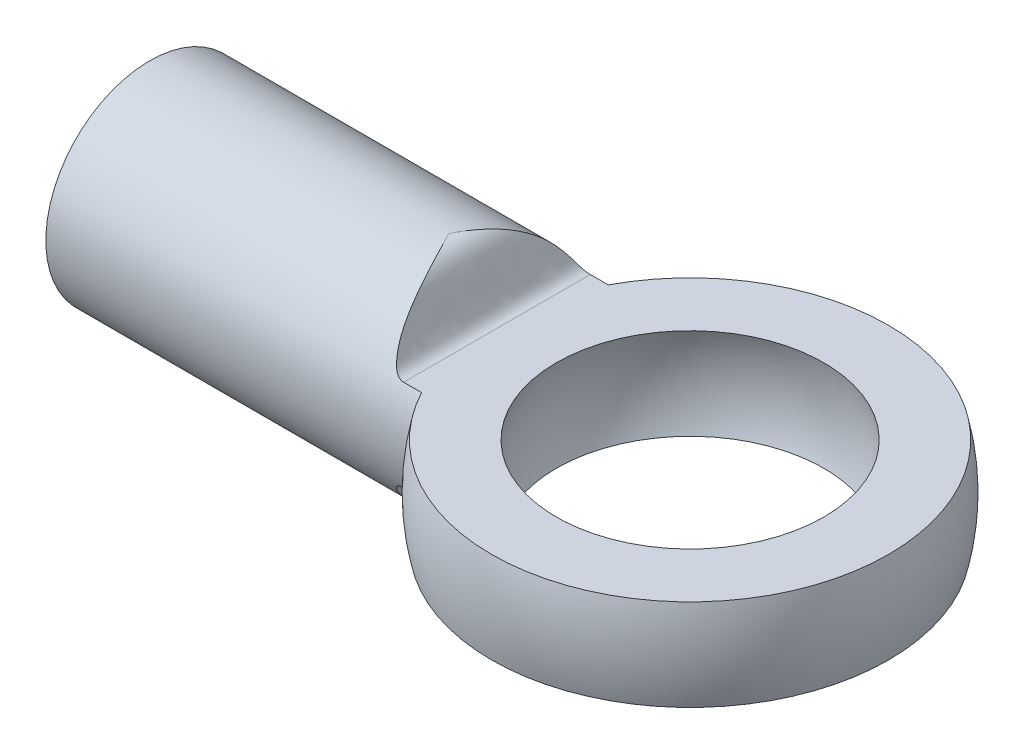
ISO-10303-21;
HEADER;
FILE_DESCRIPTION(('STEP AP214'),'2;1');
FILE_NAME('part.step','',(''),(''),'','','');
FILE_SCHEMA(('AUTOMOTIVE_DESIGN { 1 0 10303 214 1 1 1 1 }'));
ENDSEC;
DATA;
#1=APPLICATION_CONTEXT('core data for automotive mechanical design processes');
#2=APPLICATION_PROTOCOL_DEFINITION('international standard','automotive_design',2000,#1);
#3=PRODUCT_CONTEXT('',#1,'mechanical');
#4=PRODUCT('Part','Part','',(#3));
#5=PRODUCT_RELATED_PRODUCT_CATEGORY('part','',(#4));
#6=PRODUCT_DEFINITION_FORMATION('','',#4);
#7=PRODUCT_DEFINITION_CONTEXT('part definition',#1,'design');
#8=PRODUCT_DEFINITION('design','',#6,#7);
#9=PRODUCT_DEFINITION_SHAPE('','',#8);
#10=(LENGTH_UNIT() NAMED_UNIT(*) SI_UNIT(.MILLI.,.METRE.));
#11=(NAMED_UNIT(*) PLANE_ANGLE_UNIT() SI_UNIT($,.RADIAN.));
#12=(NAMED_UNIT(*) SI_UNIT($,.STERADIAN.) SOLID_ANGLE_UNIT());
#13=UNCERTAINTY_MEASURE_WITH_UNIT(LENGTH_MEASURE(1.E-05),#10,'distance_accuracy_value','');
#14=(GEOMETRIC_REPRESENTATION_CONTEXT(3) GLOBAL_UNCERTAINTY_ASSIGNED_CONTEXT((#13)) GLOBAL_UNIT_ASSIGNED_CONTEXT((#10,
#11,#12)) REPRESENTATION_CONTEXT('',''));
#15=CARTESIAN_POINT('',(0.,0.,0.));
#16=DIRECTION('',(0.,0.,1.));
#17=DIRECTION('',(1.,0.,0.));
#18=AXIS2_PLACEMENT_3D('',#15,#16,#17);
#19=CARTESIAN_POINT('',(-1.07000376947303,0.,0.));
#20=DIRECTION('',(1.,0.,0.));
#21=DIRECTION('',(0.,0.,-1.));
#22=AXIS2_PLACEMENT_3D('',#19,#20,#21);
#23=CYLINDRICAL_SURFACE('',#22,2.5);
#24=CARTESIAN_POINT('',(-13.,0.,0.));
#25=DIRECTION('',(1.,0.,0.));
#26=DIRECTION('',(0.,0.,-1.));
#27=AXIS2_PLACEMENT_3D('',#24,#25,#26);
#28=CIRCLE('',#27,2.5);
#29=CARTESIAN_POINT('',(-13.,0.,-2.5));
#30=VERTEX_POINT('',#29);
#31=EDGE_CURVE('E214',#30,#30,#28,.T.);
#32=ORIENTED_EDGE('',*,*,#31,.T.);
#33=EDGE_LOOP('',(#32));
#34=FACE_BOUND('',#33,.T.);
#35=CARTESIAN_POINT('',(-4.64650406219557,-1.1,2.24499443206436));
#36=CARTESIAN_POINT('',(-4.65358787740171,-1.09999967125129,2.24499442127416));
#37=CARTESIAN_POINT('',(-4.66067129077242,-1.1002383998479,2.24487764418432));
#38=CARTESIAN_POINT('',(-4.67479903009355,-1.10122908992279,2.2443918834458));
#39=CARTESIAN_POINT('',(-4.68184331689697,-1.10198149553234,2.24402268154721));
#40=CARTESIAN_POINT('',(-4.70277411698797,-1.10505153838962,2.24251351677639));
#41=CARTESIAN_POINT('',(-4.71652766960679,-1.10818135035136,2.24097234050416));
#42=CARTESIAN_POINT('',(-4.74321984386875,-1.1166501431242,2.23676423279798));
#43=CARTESIAN_POINT('',(-4.75615445841371,-1.12199914432153,2.23409219402461));
#44=CARTESIAN_POINT('',(-4.78075640025581,-1.13458860730942,2.22772489317636));
#45=CARTESIAN_POINT('',(-4.79242496739143,-1.14182719452623,2.22403064497305));
#46=CARTESIAN_POINT('',(-4.81844458922913,-1.16065043658863,2.21428057641237));
#47=CARTESIAN_POINT('',(-4.83220195912403,-1.17285406008639,2.20785602590706));
#48=CARTESIAN_POINT('',(-4.85750848764157,-1.19885050791023,2.19385017394148));
#49=CARTESIAN_POINT('',(-4.86904513028212,-1.21265167571546,2.18626272556819));
#50=CARTESIAN_POINT('',(-4.8963466577192,-1.24896220175239,2.16580988550255));
#51=CARTESIAN_POINT('',(-4.91088840095924,-1.27204096513273,2.15235832452112));
#52=CARTESIAN_POINT('',(-4.93093561885043,-1.3070284557925,2.13116566553633));
#53=CARTESIAN_POINT('',(-4.93733321246259,-1.31877291217642,2.12391895974521));
#54=CARTESIAN_POINT('',(-4.94973811510066,-1.34228698641715,2.10913669984174));
#55=CARTESIAN_POINT('',(-4.95574549618684,-1.35405659921132,2.10160119947191));
#56=CARTESIAN_POINT('',(-4.97336860259375,-1.38943622309456,2.07852417576554));
#57=CARTESIAN_POINT('',(-4.98452675453682,-1.41301005989113,2.06257675847777));
#58=CARTESIAN_POINT('',(-5.00572060308514,-1.45988402300676,2.02966951798857));
#59=CARTESIAN_POINT('',(-5.01575809755814,-1.48318453246195,2.0127113853329));
#60=CARTESIAN_POINT('',(-5.04673498964143,-1.55785808890464,1.95633366430632));
#61=CARTESIAN_POINT('',(-5.06589272849776,-1.6084978303646,1.91494980917182));
#62=CARTESIAN_POINT('',(-5.10196240005302,-1.70684127900028,1.82784682294097));
#63=CARTESIAN_POINT('',(-5.11887097857866,-1.75454054544729,1.78212138747797));
#64=CARTESIAN_POINT('',(-5.15212546955285,-1.84614665204281,1.68703582041841));
#65=CARTESIAN_POINT('',(-5.16847260987172,-1.89006213346152,1.63768447477214));
#66=CARTESIAN_POINT('',(-5.19326704397713,-1.95284368231409,1.56124640343536));
#67=CARTESIAN_POINT('',(-5.2015764201322,-1.97325322822113,1.53536858967057));
#68=CARTESIAN_POINT('',(-5.21830418104778,-2.01301847322483,1.48284908345514));
#69=CARTESIAN_POINT('',(-5.22672256857028,-2.03237414555487,1.45620737162899));
#70=CARTESIAN_POINT('',(-5.25350112854981,-2.09147539476314,1.37138391363323));
#71=CARTESIAN_POINT('',(-5.27223432053005,-2.12925931911334,1.31193347347293));
#72=CARTESIAN_POINT('',(-5.31142408280054,-2.19946881346809,1.19048790501048));
#73=CARTESIAN_POINT('',(-5.33188089675513,-2.23189362394212,1.12849241755841));
#74=CARTESIAN_POINT('',(-5.37486321112986,-2.29121827114159,1.00257745080242));
#75=CARTESIAN_POINT('',(-5.39738923800642,-2.3181166961591,0.938657484662151));
#76=CARTESIAN_POINT('',(-5.44466768685519,-2.36630705824672,0.809534178811279));
#77=CARTESIAN_POINT('',(-5.46942065939641,-2.38759760373933,0.744330524863584));
#78=CARTESIAN_POINT('',(-5.53936515811499,-2.43754147072666,0.567270441379082));
#79=CARTESIAN_POINT('',(-5.58672430799083,-2.46089994631202,0.454739528183783));
#80=CARTESIAN_POINT('',(-5.68771222333093,-2.49191145541659,0.230577353527971));
#81=CARTESIAN_POINT('',(-5.74132977568913,-2.49959213554635,0.118944854764666));
#82=CARTESIAN_POINT('',(-5.79927631899614,-2.49999474164144,0.00592904072314763));
#83=CARTESIAN_POINT('',(-5.80079924685742,-2.50000001333477,0.00296393327471329));
#84=CARTESIAN_POINT('',(-5.80232420778003,-2.5,0.));
#85=B_SPLINE_CURVE_WITH_KNOTS('',3,(#35,#36,#37,#38,#39,#40,#41,#42,#43,#44,#45,#46,#47,#48,#49,
#50,#51,#52,#53,#54,#55,#56,#57,#58,#59,#60,#61,#62,#63,#64,#65,#66,#67,#68,#69,#70,#71,#72,#73,
#74,#75,#76,#77,#78,#79,#80,#81,#82,#83,#84),.UNSPECIFIED.,.F.,.F.,(4,2,2,2,2,2,2,2,2,2,2,2,2,2,
2,2,2,2,2,2,2,2,2,2,4),(0.,0.0212437547785112,0.0425059004611826,0.0848255252951449,
0.127338353835936,0.169809166530501,0.227913812617447,0.286336917608966,0.377295191324441,
0.422930677717603,0.468557712535144,0.56022517201402,0.651743389792518,0.855864007583603,
1.06028569700472,1.26422742582295,1.3661728059433,1.46812077409799,1.68651023702028,
1.90493062510933,2.12340673921738,2.34193701651247,2.71359827134692,3.08460356138052,
3.09460357635037),.UNSPECIFIED.);
#86=CARTESIAN_POINT('',(-4.64650406219557,-1.1,2.24499443206436));
#87=VERTEX_POINT('',#86);
#88=CARTESIAN_POINT('',(-5.80232420778005,-2.5,0.));
#89=VERTEX_POINT('',#88);
#90=EDGE_CURVE('E96',#87,#89,#85,.T.);
#91=ORIENTED_EDGE('',*,*,#90,.F.);
#92=DIRECTION('',(1.,0.,0.));
#93=VECTOR('',#92,1.);
#94=CARTESIAN_POINT('',(-1.07000376947303,-1.1,2.24499443206436));
#95=LINE('',#94,#93);
#96=CARTESIAN_POINT('',(-4.2142615011411,-1.1,2.24499443206436));
#97=VERTEX_POINT('',#96);
#98=EDGE_CURVE('E92',#87,#97,#95,.T.);
#99=ORIENTED_EDGE('',*,*,#98,.T.);
#100=CARTESIAN_POINT('',(-4.2142615011411,0.,0.));
#101=DIRECTION('',(1.,0.,0.));
#102=DIRECTION('',(0.,0.,-1.));
#103=AXIS2_PLACEMENT_3D('',#100,#101,#102);
#104=CIRCLE('',#103,2.5);
#105=CARTESIAN_POINT('',(-4.2142615011411,1.1,2.24499443206436));
#106=VERTEX_POINT('',#105);
#107=EDGE_CURVE('E206',#106,#97,#104,.T.);
#108=ORIENTED_EDGE('',*,*,#107,.F.);
#109=DIRECTION('',(1.,0.,0.));
#110=VECTOR('',#109,1.);
#111=CARTESIAN_POINT('',(-1.07000376947303,1.1,2.24499443206436));
#112=LINE('',#111,#110);
#113=CARTESIAN_POINT('',(-4.64650406219557,1.1,2.24499443206436));
#114=VERTEX_POINT('',#113);
#115=EDGE_CURVE('E52',#106,#114,#112,.F.);
#116=ORIENTED_EDGE('',*,*,#115,.T.);
#117=CARTESIAN_POINT('',(-4.64650406219557,1.1,2.24499443206436));
#118=CARTESIAN_POINT('',(-4.65358787740171,1.09999967125129,2.24499442127416));
#119=CARTESIAN_POINT('',(-4.66067129077241,1.1002383998479,2.24487764418432));
#120=CARTESIAN_POINT('',(-4.67479903009352,1.10122908992279,2.2443918834458));
#121=CARTESIAN_POINT('',(-4.68184331689694,1.10198149553234,2.24402268154721));
#122=CARTESIAN_POINT('',(-4.70277411698792,1.10505153838961,2.2425135167764));
#123=CARTESIAN_POINT('',(-4.71652766960672,1.10818135035134,2.24097234050416));
#124=CARTESIAN_POINT('',(-4.74321984386865,1.11665014312416,2.236764232798));
#125=CARTESIAN_POINT('',(-4.75615445841361,1.12199914432148,2.23409219402463));
#126=CARTESIAN_POINT('',(-4.78075640025569,1.13458860730935,2.2277248931764));
#127=CARTESIAN_POINT('',(-4.7924249673913,1.14182719452615,2.2240306449731));
#128=CARTESIAN_POINT('',(-4.81844458922899,1.1606504365885,2.21428057641242));
#129=CARTESIAN_POINT('',(-4.83220195912388,1.17285406008622,2.20785602590706));
#130=CARTESIAN_POINT('',(-4.85750848764141,1.19885050791009,2.19385017394165));
#131=CARTESIAN_POINT('',(-4.86904513028196,1.2126516757154,2.18626272556854));
#132=CARTESIAN_POINT('',(-4.89634665771903,1.24896220175233,2.16580988550304));
#133=CARTESIAN_POINT('',(-4.91088840095907,1.27204096513248,2.15235832452135));
#134=CARTESIAN_POINT('',(-4.93093561885024,1.30702845579215,2.13116566553651));
#135=CARTESIAN_POINT('',(-4.93733321246241,1.31877291217606,2.12391895974542));
#136=CARTESIAN_POINT('',(-4.94973811510047,1.34228698641678,2.10913669984199));
#137=CARTESIAN_POINT('',(-4.95574549618664,1.35405659921094,2.10160119947216));
#138=CARTESIAN_POINT('',(-4.97336860259355,1.38943622309413,2.07852417576582));
#139=CARTESIAN_POINT('',(-4.98452675453661,1.41301005989068,2.06257675847807));
#140=CARTESIAN_POINT('',(-5.00572060308492,1.45988402300626,2.02966951798893));
#141=CARTESIAN_POINT('',(-5.01575809755792,1.48318453246143,2.01271138533329));
#142=CARTESIAN_POINT('',(-5.0467349896412,1.55785808890406,1.95633366430678));
#143=CARTESIAN_POINT('',(-5.06589272849753,1.60849783036398,1.91494980917234));
#144=CARTESIAN_POINT('',(-5.10196240005278,1.70684127899961,1.82784682294159));
#145=CARTESIAN_POINT('',(-5.11887097857841,1.7545405454466,1.78212138747865));
#146=CARTESIAN_POINT('',(-5.15212546955259,1.8461466520421,1.68703582041918));
#147=CARTESIAN_POINT('',(-5.16847260987145,1.89006213346081,1.63768447477295));
#148=CARTESIAN_POINT('',(-5.19326704397685,1.95284368231339,1.56124640343623));
#149=CARTESIAN_POINT('',(-5.20157642013192,1.97325322822044,1.53536858967146));
#150=CARTESIAN_POINT('',(-5.21830418104749,2.01301847322415,1.48284908345606));
#151=CARTESIAN_POINT('',(-5.22672256856998,2.03237414555419,1.45620737162993));
#152=CARTESIAN_POINT('',(-5.25350112854952,2.09147539476253,1.37138391363417));
#153=CARTESIAN_POINT('',(-5.27223432052977,2.12925931911279,1.31193347347383));
#154=CARTESIAN_POINT('',(-5.31142408280027,2.19946881346764,1.19048790501132));
#155=CARTESIAN_POINT('',(-5.33188089675486,2.23189362394171,1.12849241755922));
#156=CARTESIAN_POINT('',(-5.37486321112955,2.29121827114121,1.0025774508033));
#157=CARTESIAN_POINT('',(-5.39738923800607,2.31811669615874,0.938657484663125));
#158=CARTESIAN_POINT('',(-5.44466768685476,2.3663070582463,0.809534178812424));
#159=CARTESIAN_POINT('',(-5.46942065939596,2.38759760373885,0.744330524864804));
#160=CARTESIAN_POINT('',(-5.53936515811447,2.43754147072657,0.567270441380276));
#161=CARTESIAN_POINT('',(-5.58672430799024,2.46089994631273,0.45473952818485));
#162=CARTESIAN_POINT('',(-5.68771222333072,2.49191145541563,0.230577353528713));
#163=CARTESIAN_POINT('',(-5.7413297756894,2.49959213554287,0.11894485476521));
#164=CARTESIAN_POINT('',(-5.79927631899617,2.49999474164126,0.00592904072315649));
#165=CARTESIAN_POINT('',(-5.80079924685743,2.50000001333468,0.00296393327471785));
#166=CARTESIAN_POINT('',(-5.80232420778003,2.5,0.));
#167=B_SPLINE_CURVE_WITH_KNOTS('',3,(#117,#118,#119,#120,#121,#122,#123,#124,#125,#126,#127,
#128,#129,#130,#131,#132,#133,#134,#135,#136,#137,#138,#139,#140,#141,#142,#143,#144,#145,#146,
#147,#148,#149,#150,#151,#152,#153,#154,#155,#156,#157,#158,#159,#160,#161,#162,#163,#164,#165,
#166),.UNSPECIFIED.,.F.,.F.,(4,2,2,2,2,2,2,2,2,2,2,2,2,2,2,2,2,2,2,2,2,2,2,2,4),(0.,
0.0212437547784895,0.0425059004611395,0.0848255252950576,0.127338353835805,0.169809166530327,
0.227913812617215,0.286336917608673,0.377295191324031,0.422930677717145,0.468557712534632,
0.560225172013416,0.651743389791807,0.855864007582712,1.06028569700367,1.26422742582182,
1.36617280594214,1.46812077409679,1.68651023701925,1.90493062510843,2.12340673921618,
2.34193701651105,2.71359827134579,3.08460356138052,3.09460357635035),.UNSPECIFIED.);
#168=CARTESIAN_POINT('',(-5.80232420778005,2.5,0.));
#169=VERTEX_POINT('',#168);
#170=EDGE_CURVE('E155',#169,#114,#167,.F.);
#171=ORIENTED_EDGE('',*,*,#170,.F.);
#172=CARTESIAN_POINT('',(-4.64650406219557,1.1,-2.24499443206436));
#173=CARTESIAN_POINT('',(-4.65358787740171,1.09999967125129,-2.24499442127416));
#174=CARTESIAN_POINT('',(-4.66067129077241,1.1002383998479,-2.24487764418432));
#175=CARTESIAN_POINT('',(-4.67479903009352,1.10122908992279,-2.2443918834458));
#176=CARTESIAN_POINT('',(-4.68184331689694,1.10198149553234,-2.24402268154721));
#177=CARTESIAN_POINT('',(-4.70277411698792,1.10505153838961,-2.2425135167764));
#178=CARTESIAN_POINT('',(-4.71652766960672,1.10818135035134,-2.24097234050416));
#179=CARTESIAN_POINT('',(-4.74321984386865,1.11665014312416,-2.236764232798));
#180=CARTESIAN_POINT('',(-4.75615445841361,1.12199914432148,-2.23409219402463));
#181=CARTESIAN_POINT('',(-4.78075640025569,1.13458860730935,-2.2277248931764));
#182=CARTESIAN_POINT('',(-4.7924249673913,1.14182719452615,-2.2240306449731));
#183=CARTESIAN_POINT('',(-4.81844458922899,1.1606504365885,-2.21428057641242));
#184=CARTESIAN_POINT('',(-4.83220195912388,1.17285406008622,-2.20785602590706));
#185=CARTESIAN_POINT('',(-4.85750848764141,1.19885050791009,-2.19385017394165));
#186=CARTESIAN_POINT('',(-4.86904513028196,1.2126516757154,-2.18626272556854));
#187=CARTESIAN_POINT('',(-4.89634665771903,1.24896220175233,-2.16580988550304));
#188=CARTESIAN_POINT('',(-4.91088840095907,1.27204096513248,-2.15235832452135));
#189=CARTESIAN_POINT('',(-4.93093561885024,1.30702845579215,-2.13116566553651));
#190=CARTESIAN_POINT('',(-4.93733321246241,1.31877291217606,-2.12391895974542));
#191=CARTESIAN_POINT('',(-4.94973811510047,1.34228698641678,-2.10913669984199));
#192=CARTESIAN_POINT('',(-4.95574549618664,1.35405659921094,-2.10160119947216));
#193=CARTESIAN_POINT('',(-4.97336860259355,1.38943622309413,-2.07852417576582));
#194=CARTESIAN_POINT('',(-4.98452675453661,1.41301005989068,-2.06257675847807));
#195=CARTESIAN_POINT('',(-5.00572060308492,1.45988402300626,-2.02966951798893));
#196=CARTESIAN_POINT('',(-5.01575809755792,1.48318453246143,-2.01271138533329));
#197=CARTESIAN_POINT('',(-5.0467349896412,1.55785808890406,-1.95633366430678));
#198=CARTESIAN_POINT('',(-5.06589272849753,1.60849783036398,-1.91494980917234));
#199=CARTESIAN_POINT('',(-5.10196240005278,1.70684127899961,-1.82784682294159));
#200=CARTESIAN_POINT('',(-5.11887097857841,1.7545405454466,-1.78212138747865));
#201=CARTESIAN_POINT('',(-5.15212546955259,1.8461466520421,-1.68703582041918));
#202=CARTESIAN_POINT('',(-5.16847260987145,1.89006213346081,-1.63768447477295));
#203=CARTESIAN_POINT('',(-5.19326704397685,1.95284368231339,-1.56124640343623));
#204=CARTESIAN_POINT('',(-5.20157642013192,1.97325322822044,-1.53536858967146));
#205=CARTESIAN_POINT('',(-5.21830418104749,2.01301847322415,-1.48284908345606));
#206=CARTESIAN_POINT('',(-5.22672256856998,2.03237414555419,-1.45620737162993));
#207=CARTESIAN_POINT('',(-5.25350112854952,2.09147539476253,-1.37138391363417));
#208=CARTESIAN_POINT('',(-5.27223432052977,2.12925931911279,-1.31193347347383));
#209=CARTESIAN_POINT('',(-5.31142408280027,2.19946881346764,-1.19048790501132));
#210=CARTESIAN_POINT('',(-5.33188089675486,2.23189362394171,-1.12849241755922));
#211=CARTESIAN_POINT('',(-5.37486321112955,2.29121827114121,-1.0025774508033));
#212=CARTESIAN_POINT('',(-5.39738923800607,2.31811669615874,-0.938657484663125));
#213=CARTESIAN_POINT('',(-5.44466768685476,2.3663070582463,-0.809534178812424));
#214=CARTESIAN_POINT('',(-5.46942065939596,2.38759760373885,-0.744330524864804));
#215=CARTESIAN_POINT('',(-5.53936515811447,2.43754147072657,-0.567270441380276));
#216=CARTESIAN_POINT('',(-5.58672430799024,2.46089994631273,-0.45473952818485));
#217=CARTESIAN_POINT('',(-5.68771222333072,2.49191145541563,-0.230577353528713));
#218=CARTESIAN_POINT('',(-5.7413297756894,2.49959213554287,-0.11894485476521));
#219=CARTESIAN_POINT('',(-5.79927631899617,2.49999474164126,-0.00592904072315649));
#220=CARTESIAN_POINT('',(-5.80079924685743,2.50000001333468,-0.00296393327471785));
#221=CARTESIAN_POINT('',(-5.80232420778003,2.5,0.));
#222=B_SPLINE_CURVE_WITH_KNOTS('',3,(#172,#173,#174,#175,#176,#177,#178,#179,#180,#181,#182,
#183,#184,#185,#186,#187,#188,#189,#190,#191,#192,#193,#194,#195,#196,#197,#198,#199,#200,#201,
#202,#203,#204,#205,#206,#207,#208,#209,#210,#211,#212,#213,#214,#215,#216,#217,#218,#219,#220,
#221),.UNSPECIFIED.,.F.,.F.,(4,2,2,2,2,2,2,2,2,2,2,2,2,2,2,2,2,2,2,2,2,2,2,2,4),(0.,
0.0212437547784895,0.0425059004611395,0.0848255252950576,0.127338353835805,0.169809166530327,
0.227913812617215,0.286336917608673,0.377295191324031,0.422930677717145,0.468557712534632,
0.560225172013416,0.651743389791807,0.855864007582712,1.06028569700367,1.26422742582182,
1.36617280594214,1.46812077409679,1.68651023701925,1.90493062510843,2.12340673921618,
2.34193701651105,2.71359827134579,3.08460356138052,3.09460357635035),.UNSPECIFIED.);
#223=CARTESIAN_POINT('',(-4.64650406219557,1.1,-2.24499443206436));
#224=VERTEX_POINT('',#223);
#225=EDGE_CURVE('E95',#169,#224,#222,.F.);
#226=ORIENTED_EDGE('',*,*,#225,.T.);
#227=DIRECTION('',(1.,0.,0.));
#228=VECTOR('',#227,1.);
#229=CARTESIAN_POINT('',(-1.07000376947303,1.1,-2.24499443206436));
#230=LINE('',#229,#228);
#231=CARTESIAN_POINT('',(-4.2142615011411,1.1,-2.24499443206436));
#232=VERTEX_POINT('',#231);
#233=EDGE_CURVE('E60',#224,#232,#230,.T.);
#234=ORIENTED_EDGE('',*,*,#233,.T.);
#235=CARTESIAN_POINT('',(-4.2142615011411,-1.1,-2.24499443206436));
#236=VERTEX_POINT('',#235);
#237=EDGE_CURVE('E102',#236,#232,#104,.T.);
#238=ORIENTED_EDGE('',*,*,#237,.F.);
#239=DIRECTION('',(1.,0.,0.));
#240=VECTOR('',#239,1.);
#241=CARTESIAN_POINT('',(-1.07000376947303,-1.1,-2.24499443206436));
#242=LINE('',#241,#240);
#243=CARTESIAN_POINT('',(-4.64650406219557,-1.1,-2.24499443206436));
#244=VERTEX_POINT('',#243);
#245=EDGE_CURVE('E91',#236,#244,#242,.F.);
#246=ORIENTED_EDGE('',*,*,#245,.T.);
#247=CARTESIAN_POINT('',(-4.64650406219557,-1.1,-2.24499443206436));
#248=CARTESIAN_POINT('',(-4.65358787740171,-1.09999967125129,-2.24499442127416));
#249=CARTESIAN_POINT('',(-4.66067129077242,-1.1002383998479,-2.24487764418432));
#250=CARTESIAN_POINT('',(-4.67479903009355,-1.10122908992279,-2.2443918834458));
#251=CARTESIAN_POINT('',(-4.68184331689697,-1.10198149553234,-2.24402268154721));
#252=CARTESIAN_POINT('',(-4.70277411698797,-1.10505153838962,-2.24251351677639));
#253=CARTESIAN_POINT('',(-4.71652766960679,-1.10818135035136,-2.24097234050416));
#254=CARTESIAN_POINT('',(-4.74321984386875,-1.1166501431242,-2.23676423279798));
#255=CARTESIAN_POINT('',(-4.75615445841371,-1.12199914432153,-2.23409219402461));
#256=CARTESIAN_POINT('',(-4.78075640025581,-1.13458860730942,-2.22772489317636));
#257=CARTESIAN_POINT('',(-4.79242496739143,-1.14182719452623,-2.22403064497305));
#258=CARTESIAN_POINT('',(-4.81844458922913,-1.16065043658863,-2.21428057641237));
#259=CARTESIAN_POINT('',(-4.83220195912403,-1.17285406008639,-2.20785602590706));
#260=CARTESIAN_POINT('',(-4.85750848764157,-1.19885050791023,-2.19385017394148));
#261=CARTESIAN_POINT('',(-4.86904513028212,-1.21265167571546,-2.18626272556819));
#262=CARTESIAN_POINT('',(-4.8963466577192,-1.24896220175239,-2.16580988550255));
#263=CARTESIAN_POINT('',(-4.91088840095924,-1.27204096513273,-2.15235832452112));
#264=CARTESIAN_POINT('',(-4.93093561885043,-1.3070284557925,-2.13116566553633));
#265=CARTESIAN_POINT('',(-4.93733321246259,-1.31877291217642,-2.12391895974521));
#266=CARTESIAN_POINT('',(-4.94973811510066,-1.34228698641715,-2.10913669984174));
#267=CARTESIAN_POINT('',(-4.95574549618684,-1.35405659921132,-2.10160119947191));
#268=CARTESIAN_POINT('',(-4.97336860259375,-1.38943622309456,-2.07852417576554));
#269=CARTESIAN_POINT('',(-4.98452675453682,-1.41301005989113,-2.06257675847777));
#270=CARTESIAN_POINT('',(-5.00572060308514,-1.45988402300676,-2.02966951798857));
#271=CARTESIAN_POINT('',(-5.01575809755814,-1.48318453246195,-2.0127113853329));
#272=CARTESIAN_POINT('',(-5.04673498964143,-1.55785808890464,-1.95633366430632));
#273=CARTESIAN_POINT('',(-5.06589272849776,-1.6084978303646,-1.91494980917182));
#274=CARTESIAN_POINT('',(-5.10196240005302,-1.70684127900028,-1.82784682294097));
#275=CARTESIAN_POINT('',(-5.11887097857866,-1.75454054544729,-1.78212138747797));
#276=CARTESIAN_POINT('',(-5.15212546955285,-1.84614665204281,-1.68703582041841));
#277=CARTESIAN_POINT('',(-5.16847260987172,-1.89006213346152,-1.63768447477214));
#278=CARTESIAN_POINT('',(-5.19326704397713,-1.95284368231409,-1.56124640343536));
#279=CARTESIAN_POINT('',(-5.2015764201322,-1.97325322822113,-1.53536858967057));
#280=CARTESIAN_POINT('',(-5.21830418104778,-2.01301847322483,-1.48284908345514));
#281=CARTESIAN_POINT('',(-5.22672256857028,-2.03237414555487,-1.45620737162899));
#282=CARTESIAN_POINT('',(-5.25350112854981,-2.09147539476314,-1.37138391363323));
#283=CARTESIAN_POINT('',(-5.27223432053005,-2.12925931911334,-1.31193347347293));
#284=CARTESIAN_POINT('',(-5.31142408280054,-2.19946881346809,-1.19048790501048));
#285=CARTESIAN_POINT('',(-5.33188089675513,-2.23189362394212,-1.12849241755841));
#286=CARTESIAN_POINT('',(-5.37486321112986,-2.29121827114159,-1.00257745080242));
#287=CARTESIAN_POINT('',(-5.39738923800642,-2.3181166961591,-0.938657484662151));
#288=CARTESIAN_POINT('',(-5.44466768685519,-2.36630705824672,-0.809534178811279));
#289=CARTESIAN_POINT('',(-5.46942065939641,-2.38759760373933,-0.744330524863584));
#290=CARTESIAN_POINT('',(-5.53936515811499,-2.43754147072666,-0.567270441379082));
#291=CARTESIAN_POINT('',(-5.58672430799083,-2.46089994631202,-0.454739528183783));
#292=CARTESIAN_POINT('',(-5.68771222333093,-2.49191145541659,-0.230577353527971));
#293=CARTESIAN_POINT('',(-5.74132977568913,-2.49959213554635,-0.118944854764666));
#294=CARTESIAN_POINT('',(-5.79927631899614,-2.49999474164144,-0.00592904072314763));
#295=CARTESIAN_POINT('',(-5.80079924685742,-2.50000001333477,-0.00296393327471329));
#296=CARTESIAN_POINT('',(-5.80232420778003,-2.5,0.));
#297=B_SPLINE_CURVE_WITH_KNOTS('',3,(#247,#248,#249,#250,#251,#252,#253,#254,#255,#256,#257,
#258,#259,#260,#261,#262,#263,#264,#265,#266,#267,#268,#269,#270,#271,#272,#273,#274,#275,#276,
#277,#278,#279,#280,#281,#282,#283,#284,#285,#286,#287,#288,#289,#290,#291,#292,#293,#294,#295,
#296),.UNSPECIFIED.,.F.,.F.,(4,2,2,2,2,2,2,2,2,2,2,2,2,2,2,2,2,2,2,2,2,2,2,2,4),(0.,
0.0212437547785112,0.0425059004611826,0.0848255252951449,0.127338353835936,0.169809166530501,
0.227913812617447,0.286336917608966,0.377295191324441,0.422930677717603,0.468557712535144,
0.56022517201402,0.651743389792518,0.855864007583603,1.06028569700472,1.26422742582295,
1.3661728059433,1.46812077409799,1.68651023702028,1.90493062510933,2.12340673921738,
2.34193701651247,2.71359827134692,3.08460356138052,3.09460357635037),.UNSPECIFIED.);
#298=EDGE_CURVE('E99',#244,#89,#297,.T.);
#299=ORIENTED_EDGE('',*,*,#298,.T.);
#300=EDGE_LOOP('',(#91,#99,#108,#116,#171,#226,#234,#238,#246,#299));
#301=FACE_BOUND('',#300,.T.);
#302=ADVANCED_FACE('F37',(#34,#301),#23,.T.);
#303=CARTESIAN_POINT('',(0.,0.,0.));
#304=DIRECTION('',(0.,1.,0.));
#305=DIRECTION('',(1.,0.,0.));
#306=AXIS2_PLACEMENT_3D('',#303,#304,#305);
#307=SPHERICAL_SURFACE('',#306,3.4);
#308=CARTESIAN_POINT('',(0.,-1.1,0.));
#309=DIRECTION('',(0.,1.,0.));
#310=DIRECTION('',(0.,0.,1.));
#311=AXIS2_PLACEMENT_3D('',#308,#309,#310);
#312=CIRCLE('',#311,3.21714158842908);
#313=CARTESIAN_POINT('',(3.21714158842908,-1.1,0.));
#314=VERTEX_POINT('',#313);
#315=EDGE_CURVE('E204',#314,#314,#312,.T.);
#316=CARTESIAN_POINT('',(0.,1.1,0.));
#317=DIRECTION('',(0.,1.,0.));
#318=DIRECTION('',(0.,0.,1.));
#319=AXIS2_PLACEMENT_3D('',#316,#317,#318);
#320=CIRCLE('',#319,3.21714158842908);
#321=CARTESIAN_POINT('',(3.21714158842908,1.1,0.));
#322=VERTEX_POINT('',#321);
#323=EDGE_CURVE('E11',#322,#322,#320,.T.);
#324=CARTESIAN_POINT('',(3.21714158842908,-1.1,0.));
#325=CARTESIAN_POINT('',(3.22469168272295,-1.07791854727854,0.));
#326=CARTESIAN_POINT('',(3.23201436812141,-1.05575934064346,0.));
#327=CARTESIAN_POINT('',(3.24620196954468,-1.01129486338608,0.));
#328=CARTESIAN_POINT('',(3.25306688556948,-0.988989592763779,0.));
#329=CARTESIAN_POINT('',(3.26633599666259,-0.944242431372023,0.));
#330=CARTESIAN_POINT('',(3.2727401917309,-0.921800540602565,0.));
#331=CARTESIAN_POINT('',(3.28508515666798,-0.876789657273874,0.));
#332=CARTESIAN_POINT('',(3.29102592653674,-0.854220664714641,0.));
#333=CARTESIAN_POINT('',(3.30244151937884,-0.808965145605837,0.));
#334=CARTESIAN_POINT('',(3.30791634235217,-0.786278619056266,0.));
#335=CARTESIAN_POINT('',(3.31839772099213,-0.740797650789317,0.));
#336=CARTESIAN_POINT('',(3.32340427665876,-0.718003209071939,0.));
#337=CARTESIAN_POINT('',(3.33294699780827,-0.672316074726259,0.));
#338=CARTESIAN_POINT('',(3.33748316329116,-0.649423382097957,0.));
#339=CARTESIAN_POINT('',(3.34608318089893,-0.603549451928996,0.));
#340=CARTESIAN_POINT('',(3.35014703302383,-0.580568214388338,0.));
#341=CARTESIAN_POINT('',(3.35780070091967,-0.53452693791134,0.));
#342=CARTESIAN_POINT('',(3.36139051669062,-0.511466898975,0.));
#343=CARTESIAN_POINT('',(3.36809458988247,-0.465277796639453,0.));
#344=CARTESIAN_POINT('',(3.37120884730338,-0.442148733240247,0.));
#345=CARTESIAN_POINT('',(3.37696048341981,-0.395831388174936,0.));
#346=CARTESIAN_POINT('',(3.37959786211534,-0.372643106508832,0.));
#347=CARTESIAN_POINT('',(3.38439462259278,-0.326217156213334,0.));
#348=CARTESIAN_POINT('',(3.3865540043747,-0.30297948758394,0.));
#349=CARTESIAN_POINT('',(3.39039385549614,-0.2564646156043,0.));
#350=CARTESIAN_POINT('',(3.39207432483565,-0.233187412254054,0.));
#351=CARTESIAN_POINT('',(3.39495563859156,-0.186603339836999,0.));
#352=CARTESIAN_POINT('',(3.39615648300796,-0.163296470770191,0.));
#353=CARTESIAN_POINT('',(3.39807803778692,-0.116662948501884,0.));
#354=CARTESIAN_POINT('',(3.3987987481495,-0.0933362953003843,0.));
#355=CARTESIAN_POINT('',(3.39975972925603,-0.04667309473259,0.));
#356=CARTESIAN_POINT('',(3.4,-0.0233365473662951,0.));
#357=CARTESIAN_POINT('',(3.4,0.0233365473662947,0.));
#358=CARTESIAN_POINT('',(3.39975972925603,0.0466730947325896,0.));
#359=CARTESIAN_POINT('',(3.3987987481495,0.0933362953003839,0.));
#360=CARTESIAN_POINT('',(3.39807803778692,0.116662948501883,0.));
#361=CARTESIAN_POINT('',(3.39615648300796,0.163296470770191,0.));
#362=CARTESIAN_POINT('',(3.39495563859156,0.186603339836999,0.));
#363=CARTESIAN_POINT('',(3.39207432483565,0.233187412254053,0.));
#364=CARTESIAN_POINT('',(3.39039385549614,0.2564646156043,0.));
#365=CARTESIAN_POINT('',(3.3865540043747,0.30297948758394,0.));
#366=CARTESIAN_POINT('',(3.38439462259278,0.326217156213334,0.));
#367=CARTESIAN_POINT('',(3.37959786211534,0.372643106508832,0.));
#368=CARTESIAN_POINT('',(3.37696048341981,0.395831388174936,0.));
#369=CARTESIAN_POINT('',(3.37120884730338,0.442148733240246,0.));
#370=CARTESIAN_POINT('',(3.36809458988247,0.465277796639453,0.));
#371=CARTESIAN_POINT('',(3.36139051669062,0.511466898974999,0.));
#372=CARTESIAN_POINT('',(3.35780070091967,0.534526937911339,0.));
#373=CARTESIAN_POINT('',(3.35014703302383,0.580568214388337,0.));
#374=CARTESIAN_POINT('',(3.34608318089893,0.603549451928996,0.));
#375=CARTESIAN_POINT('',(3.33748316329116,0.649423382097957,0.));
#376=CARTESIAN_POINT('',(3.33294699780827,0.672316074726259,0.));
#377=CARTESIAN_POINT('',(3.32340427665876,0.718003209071938,0.));
#378=CARTESIAN_POINT('',(3.31839772099213,0.740797650789316,0.));
#379=CARTESIAN_POINT('',(3.30791634235217,0.786278619056265,0.));
#380=CARTESIAN_POINT('',(3.30244151937884,0.808965145605837,0.));
#381=CARTESIAN_POINT('',(3.29102592653674,0.854220664714641,0.));
#382=CARTESIAN_POINT('',(3.28508515666798,0.876789657273874,0.));
#383=CARTESIAN_POINT('',(3.2727401917309,0.921800540602565,0.));
#384=CARTESIAN_POINT('',(3.26633599666259,0.944242431372023,0.));
#385=CARTESIAN_POINT('',(3.25306688556948,0.988989592763778,0.));
#386=CARTESIAN_POINT('',(3.24620196954468,1.01129486338608,0.));
#387=CARTESIAN_POINT('',(3.23201436812141,1.05575934064346,0.));
#388=CARTESIAN_POINT('',(3.22469168272295,1.07791854727854,0.));
#389=CARTESIAN_POINT('',(3.21714158842908,1.1,0.));
#390=B_SPLINE_CURVE_WITH_KNOTS('',3,(#324,#325,#326,#327,#328,#329,#330,#331,#332,#333,#334,
#335,#336,#337,#338,#339,#340,#341,#342,#343,#344,#345,#346,#347,#348,#349,#350,#351,#352,#353,
#354,#355,#356,#357,#358,#359,#360,#361,#362,#363,#364,#365,#366,#367,#368,#369,#370,#371,#372,
#373,#374,#375,#376,#377,#378,#379,#380,#381,#382,#383,#384,#385,#386,#387,#388,#389),
.UNSPECIFIED.,.F.,.F.,(4,2,2,2,2,2,2,2,2,2,2,2,2,2,2,2,2,2,2,2,2,2,2,2,2,2,2,2,2,2,2,2,4),(0.,
0.0700084053610632,0.140016810722127,0.21002521608319,0.280033621444253,0.350042026805316,
0.42005043216638,0.490058837527443,0.560067242888506,0.63007564824957,0.700084053610633,
0.770092458971696,0.84010086433276,0.910109269693823,0.980117675054886,1.05012608041595,
1.12013448577701,1.19014289113808,1.26015129649914,1.3301597018602,1.40016810722127,
1.47017651258233,1.54018491794339,1.61019332330446,1.68020172866552,1.75021013402658,
1.82021853938765,1.89022694474871,1.96023535010977,2.03024375547084,2.1002521608319,
2.17026056619296,2.24026897155403),.UNSPECIFIED.);
#391=EDGE_CURVE('BSEAM39',#314,#322,#390,.T.);
#392=ORIENTED_EDGE('',*,*,#315,.F.);
#393=ORIENTED_EDGE('',*,*,#323,.T.);
#394=ORIENTED_EDGE('',*,*,#391,.T.);
#395=ORIENTED_EDGE('',*,*,#391,.F.);
#396=EDGE_LOOP('',(#392,#394,#393,#395));
#397=FACE_BOUND('',#396,.T.);
#398=ADVANCED_FACE('F39',(#397),#307,.F.);
#399=CARTESIAN_POINT('',(3.21714158842908,1.1,0.));
#400=DIRECTION('',(0.,-1.,0.));
#401=DIRECTION('',(0.,0.,-1.));
#402=AXIS2_PLACEMENT_3D('',#399,#400,#401);
#403=PLANE('',#402);
#404=ORIENTED_EDGE('',*,*,#115,.F.);
#405=CARTESIAN_POINT('',(0.,1.1,0.));
#406=DIRECTION('',(0.,1.,0.));
#407=DIRECTION('',(0.,0.,1.));
#408=AXIS2_PLACEMENT_3D('',#405,#406,#407);
#409=CIRCLE('',#408,4.77493455452533);
#410=EDGE_CURVE('E45',#106,#232,#409,.T.);
#411=ORIENTED_EDGE('',*,*,#410,.T.);
#412=ORIENTED_EDGE('',*,*,#233,.F.);
#413=DIRECTION('',(0.,0.,1.));
#414=VECTOR('',#413,1.);
#415=CARTESIAN_POINT('',(-4.64650406219557,1.1,-4.901));
#416=LINE('',#415,#414);
#417=EDGE_CURVE('E149',#224,#114,#416,.T.);
#418=ORIENTED_EDGE('',*,*,#417,.T.);
#419=EDGE_LOOP('',(#404,#411,#412,#418));
#420=FACE_BOUND('',#419,.T.);
#421=ORIENTED_EDGE('',*,*,#323,.F.);
#422=EDGE_LOOP('',(#421));
#423=FACE_BOUND('',#422,.T.);
#424=ADVANCED_FACE('F190',(#420,#423),#403,.F.);
#425=CARTESIAN_POINT('',(0.,0.,0.));
#426=DIRECTION('',(0.,1.,0.));
#427=DIRECTION('',(1.,0.,0.));
#428=AXIS2_PLACEMENT_3D('',#425,#426,#427);
#429=SPHERICAL_SURFACE('',#428,4.9);
#430=ORIENTED_EDGE('',*,*,#410,.F.);
#431=ORIENTED_EDGE('',*,*,#107,.T.);
#432=CARTESIAN_POINT('',(0.,-1.1,0.));
#433=DIRECTION('',(0.,1.,0.));
#434=DIRECTION('',(0.,0.,1.));
#435=AXIS2_PLACEMENT_3D('',#432,#433,#434);
#436=CIRCLE('',#435,4.77493455452533);
#437=EDGE_CURVE('E205',#97,#236,#436,.T.);
#438=ORIENTED_EDGE('',*,*,#437,.T.);
#439=ORIENTED_EDGE('',*,*,#237,.T.);
#440=EDGE_LOOP('',(#430,#431,#438,#439));
#441=FACE_BOUND('',#440,.T.);
#442=ADVANCED_FACE('F188',(#441),#429,.T.);
#443=CARTESIAN_POINT('',(3.21714158842908,-1.1,0.));
#444=DIRECTION('',(0.,1.,0.));
#445=DIRECTION('',(0.,0.,1.));
#446=AXIS2_PLACEMENT_3D('',#443,#444,#445);
#447=PLANE('',#446);
#448=ORIENTED_EDGE('',*,*,#245,.F.);
#449=ORIENTED_EDGE('',*,*,#437,.F.);
#450=ORIENTED_EDGE('',*,*,#98,.F.);
#451=DIRECTION('',(0.,0.,-1.));
#452=VECTOR('',#451,1.);
#453=CARTESIAN_POINT('',(-4.64650406219557,-1.1,4.901));
#454=LINE('',#453,#452);
#455=EDGE_CURVE('E85',#87,#244,#454,.T.);
#456=ORIENTED_EDGE('',*,*,#455,.T.);
#457=EDGE_LOOP('',(#448,#449,#450,#456));
#458=FACE_BOUND('',#457,.T.);
#459=ORIENTED_EDGE('',*,*,#315,.T.);
#460=EDGE_LOOP('',(#459));
#461=FACE_BOUND('',#460,.T.);
#462=ADVANCED_FACE('F87',(#458,#461),#447,.F.);
#463=CARTESIAN_POINT('',(-13.,0.,-2.5));
#464=DIRECTION('',(-1.,0.,0.));
#465=DIRECTION('',(0.,0.,1.));
#466=AXIS2_PLACEMENT_3D('',#463,#464,#465);
#467=PLANE('',#466);
#468=CARTESIAN_POINT('',(-13.,0.,0.));
#469=DIRECTION('',(1.,0.,0.));
#470=DIRECTION('',(0.,0.,-1.));
#471=AXIS2_PLACEMENT_3D('',#468,#469,#470);
#472=CIRCLE('',#471,1.5);
#473=CARTESIAN_POINT('',(-13.,0.,-1.5));
#474=VERTEX_POINT('',#473);
#475=EDGE_CURVE('E161',#474,#474,#472,.T.);
#476=ORIENTED_EDGE('',*,*,#475,.T.);
#477=EDGE_LOOP('',(#476));
#478=FACE_BOUND('',#477,.T.);
#479=ORIENTED_EDGE('',*,*,#31,.F.);
#480=EDGE_LOOP('',(#479));
#481=FACE_BOUND('',#480,.T.);
#482=ADVANCED_FACE('F178',(#478,#481),#467,.T.);
#483=CARTESIAN_POINT('',(-5.97493455452533,0.,-1.5));
#484=DIRECTION('',(-1.,0.,0.));
#485=DIRECTION('',(0.,0.,1.));
#486=AXIS2_PLACEMENT_3D('',#483,#484,#485);
#487=PLANE('',#486);
#488=CARTESIAN_POINT('',(-5.97493455452533,0.,0.));
#489=DIRECTION('',(1.,0.,0.));
#490=DIRECTION('',(0.,0.,-1.));
#491=AXIS2_PLACEMENT_3D('',#488,#489,#490);
#492=CIRCLE('',#491,1.5);
#493=CARTESIAN_POINT('',(-5.97493455452533,0.,-1.5));
#494=VERTEX_POINT('',#493);
#495=EDGE_CURVE('E216',#494,#494,#492,.T.);
#496=ORIENTED_EDGE('',*,*,#495,.F.);
#497=EDGE_LOOP('',(#496));
#498=FACE_BOUND('',#497,.T.);
#499=ADVANCED_FACE('F174',(#498),#487,.T.);
#500=CARTESIAN_POINT('',(-1.07000376947303,0.,0.));
#501=DIRECTION('',(1.,0.,0.));
#502=DIRECTION('',(0.,0.,-1.));
#503=AXIS2_PLACEMENT_3D('',#500,#501,#502);
#504=CYLINDRICAL_SURFACE('',#503,1.5);
#505=ORIENTED_EDGE('',*,*,#495,.T.);
#506=EDGE_LOOP('',(#505));
#507=FACE_BOUND('',#506,.T.);
#508=ORIENTED_EDGE('',*,*,#475,.F.);
#509=EDGE_LOOP('',(#508));
#510=FACE_BOUND('',#509,.T.);
#511=ADVANCED_FACE('F170',(#507,#510),#504,.F.);
#512=CARTESIAN_POINT('',(-5.80232420778005,2.5,4.901));
#513=CARTESIAN_POINT('',(-5.47252824637268,2.5,4.901));
#514=CARTESIAN_POINT('',(-5.17946888862958,2.01912852166615,4.901));
#515=CARTESIAN_POINT('',(-5.03732865449224,1.45253814716856,4.901));
#516=CARTESIAN_POINT('',(-4.80849489656188,1.1,4.901));
#517=CARTESIAN_POINT('',(-4.64650406219557,1.1,4.901));
#518=B_SPLINE_CURVE_WITH_KNOTS('',3,(#512,#513,#514,#515,#516,#517),.UNSPECIFIED.,.F.,.F.,(4,1,
1,4),(0.,0.405026023462346,0.790027945112121,1.),.UNSPECIFIED.);
#519=DIRECTION('',(0.,0.,-1.));
#520=VECTOR('',#519,1.);
#521=SURFACE_OF_LINEAR_EXTRUSION('',#518,#520);
#522=ORIENTED_EDGE('',*,*,#170,.T.);
#523=ORIENTED_EDGE('',*,*,#417,.F.);
#524=ORIENTED_EDGE('',*,*,#225,.F.);
#525=EDGE_LOOP('',(#522,#523,#524));
#526=FACE_BOUND('',#525,.T.);
#527=ADVANCED_FACE('F166',(#526),#521,.T.);
#528=CARTESIAN_POINT('',(-4.64650406219557,-1.1,4.901));
#529=CARTESIAN_POINT('',(-4.80849489656188,-1.1,4.901));
#530=CARTESIAN_POINT('',(-5.03732865449224,-1.45253814716856,4.901));
#531=CARTESIAN_POINT('',(-5.17946888862958,-2.01912852166616,4.901));
#532=CARTESIAN_POINT('',(-5.47252824637268,-2.5,4.901));
#533=CARTESIAN_POINT('',(-5.80232420778005,-2.5,4.901));
#534=B_SPLINE_CURVE_WITH_KNOTS('',3,(#528,#529,#530,#531,#532,#533),.UNSPECIFIED.,.F.,.F.,(4,1,
1,4),(0.,0.209972054887879,0.594973976537654,1.),.UNSPECIFIED.);
#535=DIRECTION('',(0.,0.,-1.));
#536=VECTOR('',#535,1.);
#537=SURFACE_OF_LINEAR_EXTRUSION('',#534,#536);
#538=ORIENTED_EDGE('',*,*,#90,.T.);
#539=ORIENTED_EDGE('',*,*,#298,.F.);
#540=ORIENTED_EDGE('',*,*,#455,.F.);
#541=EDGE_LOOP('',(#538,#539,#540));
#542=FACE_BOUND('',#541,.T.);
#543=ADVANCED_FACE('F100',(#542),#537,.T.);
#544=CLOSED_SHELL('',(#302,#398,#424,#442,#462,#482,#499,#511,#527,#543));
#545=MANIFOLD_SOLID_BREP('B2',#544);
#546=ADVANCED_BREP_SHAPE_REPRESENTATION('',(#18,#545),#14);
#547=SHAPE_DEFINITION_REPRESENTATION(#9,#546);
ENDSEC;
END-ISO-10303-21;
